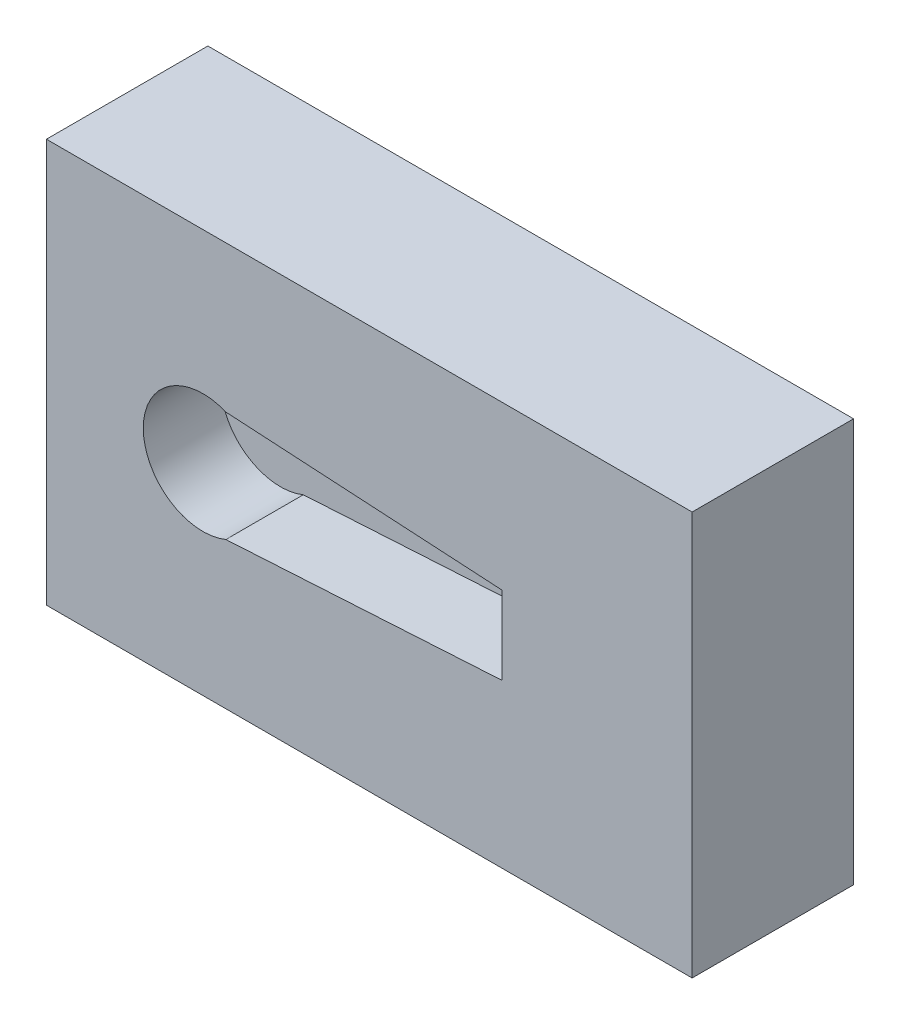
ISO-10303-21;
HEADER;
FILE_DESCRIPTION(('STEP AP214'),'2;1');
FILE_NAME('part.step','',(''),(''),'','','');
FILE_SCHEMA(('AUTOMOTIVE_DESIGN { 1 0 10303 214 1 1 1 1 }'));
ENDSEC;
DATA;
#1=APPLICATION_CONTEXT('core data for automotive mechanical design processes');
#2=APPLICATION_PROTOCOL_DEFINITION('international standard','automotive_design',2000,#1);
#3=PRODUCT_CONTEXT('',#1,'mechanical');
#4=PRODUCT('Part','Part','',(#3));
#5=PRODUCT_RELATED_PRODUCT_CATEGORY('part','',(#4));
#6=PRODUCT_DEFINITION_FORMATION('','',#4);
#7=PRODUCT_DEFINITION_CONTEXT('part definition',#1,'design');
#8=PRODUCT_DEFINITION('design','',#6,#7);
#9=PRODUCT_DEFINITION_SHAPE('','',#8);
#10=(LENGTH_UNIT() NAMED_UNIT(*) SI_UNIT(.MILLI.,.METRE.));
#11=(NAMED_UNIT(*) PLANE_ANGLE_UNIT() SI_UNIT($,.RADIAN.));
#12=(NAMED_UNIT(*) SI_UNIT($,.STERADIAN.) SOLID_ANGLE_UNIT());
#13=UNCERTAINTY_MEASURE_WITH_UNIT(LENGTH_MEASURE(1.E-05),#10,'distance_accuracy_value','');
#14=(GEOMETRIC_REPRESENTATION_CONTEXT(3) GLOBAL_UNCERTAINTY_ASSIGNED_CONTEXT((#13)) GLOBAL_UNIT_ASSIGNED_CONTEXT((#10,
#11,#12)) REPRESENTATION_CONTEXT('',''));
#15=CARTESIAN_POINT('',(0.,0.,0.));
#16=DIRECTION('',(0.,0.,1.));
#17=DIRECTION('',(1.,0.,0.));
#18=AXIS2_PLACEMENT_3D('',#15,#16,#17);
#19=CARTESIAN_POINT('',(0.,0.,10.));
#20=DIRECTION('',(0.,0.,1.));
#21=DIRECTION('',(1.,0.,0.));
#22=AXIS2_PLACEMENT_3D('',#19,#20,#21);
#23=PLANE('',#22);
#24=CARTESIAN_POINT('',(-7.96621438263229,1.28561736770692,10.));
#25=DIRECTION('',(0.,0.,1.));
#26=DIRECTION('',(1.,0.,0.));
#27=AXIS2_PLACEMENT_3D('',#24,#25,#26);
#28=CIRCLE('',#27,3.7);
#29=CARTESIAN_POINT('',(-6.55426537505447,4.70561736770692,10.));
#30=VERTEX_POINT('',#29);
#31=CARTESIAN_POINT('',(-6.55426537505447,-2.13438263229308,10.));
#32=VERTEX_POINT('',#31);
#33=EDGE_CURVE('E166',#30,#32,#28,.T.);
#34=ORIENTED_EDGE('',*,*,#33,.F.);
#35=DIRECTION('',(-0.998298031423657,0.0583184400996108,0.));
#36=VECTOR('',#35,1.);
#37=CARTESIAN_POINT('',(-6.55426537505447,4.70561736770692,10.));
#38=LINE('',#37,#36);
#39=CARTESIAN_POINT('',(10.5637856173677,3.70561736770692,10.));
#40=VERTEX_POINT('',#39);
#41=EDGE_CURVE('E180',#40,#30,#38,.T.);
#42=ORIENTED_EDGE('',*,*,#41,.F.);
#43=DIRECTION('',(0.,1.,0.));
#44=VECTOR('',#43,1.);
#45=CARTESIAN_POINT('',(10.5637856173677,-1.13438263229308,10.));
#46=LINE('',#45,#44);
#47=CARTESIAN_POINT('',(10.5637856173677,-1.13438263229308,10.));
#48=VERTEX_POINT('',#47);
#49=EDGE_CURVE('E71',#48,#40,#46,.T.);
#50=ORIENTED_EDGE('',*,*,#49,.F.);
#51=DIRECTION('',(0.998298031423657,0.0583184400996108,0.));
#52=VECTOR('',#51,1.);
#53=CARTESIAN_POINT('',(10.5637856173677,-1.13438263229308,10.));
#54=LINE('',#53,#52);
#55=EDGE_CURVE('E171',#32,#48,#54,.T.);
#56=ORIENTED_EDGE('',*,*,#55,.F.);
#57=EDGE_LOOP('',(#34,#42,#50,#56));
#58=FACE_BOUND('',#57,.T.);
#59=DIRECTION('',(0.,-1.,0.));
#60=VECTOR('',#59,1.);
#61=CARTESIAN_POINT('',(-17.6662143826323,13.7856173677069,10.));
#62=LINE('',#61,#60);
#63=CARTESIAN_POINT('',(-17.6662143826323,13.7856173677069,10.));
#64=VERTEX_POINT('',#63);
#65=CARTESIAN_POINT('',(-17.6662143826323,-11.2143826322931,10.));
#66=VERTEX_POINT('',#65);
#67=EDGE_CURVE('E110',#64,#66,#62,.T.);
#68=ORIENTED_EDGE('',*,*,#67,.T.);
#69=DIRECTION('',(1.,0.,0.));
#70=VECTOR('',#69,1.);
#71=CARTESIAN_POINT('',(-17.6662143826323,-11.2143826322931,10.));
#72=LINE('',#71,#70);
#73=CARTESIAN_POINT('',(22.3337856173677,-11.2143826322931,10.));
#74=VERTEX_POINT('',#73);
#75=EDGE_CURVE('E112',#66,#74,#72,.T.);
#76=ORIENTED_EDGE('',*,*,#75,.T.);
#77=DIRECTION('',(0.,1.,0.));
#78=VECTOR('',#77,1.);
#79=CARTESIAN_POINT('',(22.3337856173677,13.7856173677069,10.));
#80=LINE('',#79,#78);
#81=CARTESIAN_POINT('',(22.3337856173677,13.7856173677069,10.));
#82=VERTEX_POINT('',#81);
#83=EDGE_CURVE('E63',#74,#82,#80,.T.);
#84=ORIENTED_EDGE('',*,*,#83,.T.);
#85=DIRECTION('',(-1.,0.,0.));
#86=VECTOR('',#85,1.);
#87=CARTESIAN_POINT('',(-17.6662143826323,13.7856173677069,10.));
#88=LINE('',#87,#86);
#89=EDGE_CURVE('E113',#82,#64,#88,.T.);
#90=ORIENTED_EDGE('',*,*,#89,.T.);
#91=EDGE_LOOP('',(#68,#76,#84,#90));
#92=FACE_BOUND('',#91,.T.);
#93=ADVANCED_FACE('F47',(#58,#92),#23,.T.);
#94=CARTESIAN_POINT('',(-7.96621438263229,1.28561736770692,5.2));
#95=DIRECTION('',(0.,0.,1.));
#96=DIRECTION('',(1.,0.,0.));
#97=AXIS2_PLACEMENT_3D('',#94,#95,#96);
#98=CYLINDRICAL_SURFACE('',#97,3.7);
#99=ORIENTED_EDGE('',*,*,#33,.T.);
#100=DIRECTION('',(0.,0.,1.));
#101=VECTOR('',#100,1.);
#102=CARTESIAN_POINT('',(-6.55426537505447,-2.13438263229308,5.2));
#103=LINE('',#102,#101);
#104=CARTESIAN_POINT('',(-6.55426537505447,-2.13438263229308,5.2));
#105=VERTEX_POINT('',#104);
#106=EDGE_CURVE('E144',#105,#32,#103,.T.);
#107=ORIENTED_EDGE('',*,*,#106,.F.);
#108=CARTESIAN_POINT('',(-7.96621438263229,1.28561736770692,5.2));
#109=DIRECTION('',(0.,0.,1.));
#110=DIRECTION('',(1.,0.,0.));
#111=AXIS2_PLACEMENT_3D('',#108,#109,#110);
#112=CIRCLE('',#111,3.7);
#113=CARTESIAN_POINT('',(-6.55426537505447,4.70561736770692,5.2));
#114=VERTEX_POINT('',#113);
#115=EDGE_CURVE('E175',#114,#105,#112,.T.);
#116=ORIENTED_EDGE('',*,*,#115,.F.);
#117=DIRECTION('',(0.,0.,1.));
#118=VECTOR('',#117,1.);
#119=CARTESIAN_POINT('',(-6.55426537505447,4.70561736770692,5.2));
#120=LINE('',#119,#118);
#121=EDGE_CURVE('E135',#114,#30,#120,.T.);
#122=ORIENTED_EDGE('',*,*,#121,.T.);
#123=EDGE_LOOP('',(#99,#107,#116,#122));
#124=FACE_BOUND('',#123,.T.);
#125=ADVANCED_FACE('F212',(#124),#98,.F.);
#126=CARTESIAN_POINT('',(-6.55426537505447,4.70561736770692,5.2));
#127=DIRECTION('',(0.0583184400996108,0.998298031423656,0.));
#128=DIRECTION('',(-0.998298031423657,0.0583184400996108,0.));
#129=AXIS2_PLACEMENT_3D('',#126,#127,#128);
#130=PLANE('',#129);
#131=ORIENTED_EDGE('',*,*,#41,.T.);
#132=ORIENTED_EDGE('',*,*,#121,.F.);
#133=DIRECTION('',(-0.998298031423657,0.0583184400996108,0.));
#134=VECTOR('',#133,1.);
#135=CARTESIAN_POINT('',(-6.55426537505447,4.70561736770692,5.2));
#136=LINE('',#135,#134);
#137=CARTESIAN_POINT('',(10.5637856173677,3.70561736770692,5.2));
#138=VERTEX_POINT('',#137);
#139=EDGE_CURVE('E188',#138,#114,#136,.T.);
#140=ORIENTED_EDGE('',*,*,#139,.F.);
#141=DIRECTION('',(0.,0.,1.));
#142=VECTOR('',#141,1.);
#143=CARTESIAN_POINT('',(10.5637856173677,3.70561736770692,5.2));
#144=LINE('',#143,#142);
#145=EDGE_CURVE('E141',#138,#40,#144,.T.);
#146=ORIENTED_EDGE('',*,*,#145,.T.);
#147=EDGE_LOOP('',(#131,#132,#140,#146));
#148=FACE_BOUND('',#147,.T.);
#149=ADVANCED_FACE('F216',(#148),#130,.F.);
#150=CARTESIAN_POINT('',(10.5637856173677,-1.13438263229308,5.2));
#151=DIRECTION('',(1.,0.,0.));
#152=DIRECTION('',(0.,1.,0.));
#153=AXIS2_PLACEMENT_3D('',#150,#151,#152);
#154=PLANE('',#153);
#155=ORIENTED_EDGE('',*,*,#49,.T.);
#156=ORIENTED_EDGE('',*,*,#145,.F.);
#157=DIRECTION('',(0.,1.,0.));
#158=VECTOR('',#157,1.);
#159=CARTESIAN_POINT('',(10.5637856173677,-1.13438263229308,5.2));
#160=LINE('',#159,#158);
#161=CARTESIAN_POINT('',(10.5637856173677,-1.13438263229308,5.2));
#162=VERTEX_POINT('',#161);
#163=EDGE_CURVE('E184',#162,#138,#160,.T.);
#164=ORIENTED_EDGE('',*,*,#163,.F.);
#165=DIRECTION('',(0.,0.,1.));
#166=VECTOR('',#165,1.);
#167=CARTESIAN_POINT('',(10.5637856173677,-1.13438263229308,5.2));
#168=LINE('',#167,#166);
#169=EDGE_CURVE('E201',#162,#48,#168,.T.);
#170=ORIENTED_EDGE('',*,*,#169,.T.);
#171=EDGE_LOOP('',(#155,#156,#164,#170));
#172=FACE_BOUND('',#171,.T.);
#173=ADVANCED_FACE('F218',(#172),#154,.F.);
#174=CARTESIAN_POINT('',(10.5637856173677,-1.13438263229308,5.2));
#175=DIRECTION('',(0.0583184400996108,-0.998298031423656,0.));
#176=DIRECTION('',(0.998298031423657,0.0583184400996109,0.));
#177=AXIS2_PLACEMENT_3D('',#174,#175,#176);
#178=PLANE('',#177);
#179=ORIENTED_EDGE('',*,*,#55,.T.);
#180=ORIENTED_EDGE('',*,*,#169,.F.);
#181=DIRECTION('',(0.998298031423657,0.0583184400996108,0.));
#182=VECTOR('',#181,1.);
#183=CARTESIAN_POINT('',(10.5637856173677,-1.13438263229308,5.2));
#184=LINE('',#183,#182);
#185=EDGE_CURVE('E179',#105,#162,#184,.T.);
#186=ORIENTED_EDGE('',*,*,#185,.F.);
#187=ORIENTED_EDGE('',*,*,#106,.T.);
#188=EDGE_LOOP('',(#179,#180,#186,#187));
#189=FACE_BOUND('',#188,.T.);
#190=ADVANCED_FACE('F207',(#189),#178,.F.);
#191=CARTESIAN_POINT('',(-7.96621438263229,1.28561736770692,5.2));
#192=DIRECTION('',(0.,0.,1.));
#193=DIRECTION('',(1.,0.,0.));
#194=AXIS2_PLACEMENT_3D('',#191,#192,#193);
#195=PLANE('',#194);
#196=ORIENTED_EDGE('',*,*,#115,.T.);
#197=ORIENTED_EDGE('',*,*,#185,.T.);
#198=ORIENTED_EDGE('',*,*,#163,.T.);
#199=ORIENTED_EDGE('',*,*,#139,.T.);
#200=EDGE_LOOP('',(#196,#197,#198,#199));
#201=FACE_BOUND('',#200,.T.);
#202=ADVANCED_FACE('F220',(#201),#195,.T.);
#203=CARTESIAN_POINT('',(0.,0.,0.));
#204=DIRECTION('',(0.,0.,1.));
#205=DIRECTION('',(1.,0.,0.));
#206=AXIS2_PLACEMENT_3D('',#203,#204,#205);
#207=PLANE('',#206);
#208=DIRECTION('',(0.,-1.,0.));
#209=VECTOR('',#208,1.);
#210=CARTESIAN_POINT('',(-17.6662143826323,13.7856173677069,0.));
#211=LINE('',#210,#209);
#212=CARTESIAN_POINT('',(-17.6662143826323,13.7856173677069,0.));
#213=VERTEX_POINT('',#212);
#214=CARTESIAN_POINT('',(-17.6662143826323,-11.2143826322931,0.));
#215=VERTEX_POINT('',#214);
#216=EDGE_CURVE('E128',#213,#215,#211,.T.);
#217=ORIENTED_EDGE('',*,*,#216,.F.);
#218=DIRECTION('',(-1.,0.,0.));
#219=VECTOR('',#218,1.);
#220=CARTESIAN_POINT('',(-17.6662143826323,13.7856173677069,0.));
#221=LINE('',#220,#219);
#222=CARTESIAN_POINT('',(22.3337856173677,13.7856173677069,0.));
#223=VERTEX_POINT('',#222);
#224=EDGE_CURVE('E150',#223,#213,#221,.T.);
#225=ORIENTED_EDGE('',*,*,#224,.F.);
#226=DIRECTION('',(0.,1.,0.));
#227=VECTOR('',#226,1.);
#228=CARTESIAN_POINT('',(22.3337856173677,13.7856173677069,0.));
#229=LINE('',#228,#227);
#230=CARTESIAN_POINT('',(22.3337856173677,-11.2143826322931,0.));
#231=VERTEX_POINT('',#230);
#232=EDGE_CURVE('E139',#231,#223,#229,.T.);
#233=ORIENTED_EDGE('',*,*,#232,.F.);
#234=DIRECTION('',(1.,0.,0.));
#235=VECTOR('',#234,1.);
#236=CARTESIAN_POINT('',(-17.6662143826323,-11.2143826322931,0.));
#237=LINE('',#236,#235);
#238=EDGE_CURVE('E134',#215,#231,#237,.T.);
#239=ORIENTED_EDGE('',*,*,#238,.F.);
#240=EDGE_LOOP('',(#217,#225,#233,#239));
#241=FACE_BOUND('',#240,.T.);
#242=ADVANCED_FACE('F162',(#241),#207,.F.);
#243=CARTESIAN_POINT('',(-17.6662143826323,13.7856173677069,15.));
#244=DIRECTION('',(0.,-1.,0.));
#245=DIRECTION('',(0.,0.,-1.));
#246=AXIS2_PLACEMENT_3D('',#243,#244,#245);
#247=PLANE('',#246);
#248=ORIENTED_EDGE('',*,*,#89,.F.);
#249=DIRECTION('',(0.,0.,-1.));
#250=VECTOR('',#249,1.);
#251=CARTESIAN_POINT('',(22.3337856173677,13.7856173677069,15.));
#252=LINE('',#251,#250);
#253=EDGE_CURVE('E155',#82,#223,#252,.T.);
#254=ORIENTED_EDGE('',*,*,#253,.T.);
#255=ORIENTED_EDGE('',*,*,#224,.T.);
#256=DIRECTION('',(0.,0.,-1.));
#257=VECTOR('',#256,1.);
#258=CARTESIAN_POINT('',(-17.6662143826323,13.7856173677069,15.));
#259=LINE('',#258,#257);
#260=EDGE_CURVE('E129',#64,#213,#259,.T.);
#261=ORIENTED_EDGE('',*,*,#260,.F.);
#262=EDGE_LOOP('',(#248,#254,#255,#261));
#263=FACE_BOUND('',#262,.T.);
#264=ADVANCED_FACE('F164',(#263),#247,.F.);
#265=CARTESIAN_POINT('',(22.3337856173677,13.7856173677069,15.));
#266=DIRECTION('',(-1.,0.,0.));
#267=DIRECTION('',(0.,-1.,0.));
#268=AXIS2_PLACEMENT_3D('',#265,#266,#267);
#269=PLANE('',#268);
#270=ORIENTED_EDGE('',*,*,#83,.F.);
#271=DIRECTION('',(0.,0.,-1.));
#272=VECTOR('',#271,1.);
#273=CARTESIAN_POINT('',(22.3337856173677,-11.2143826322931,15.));
#274=LINE('',#273,#272);
#275=EDGE_CURVE('E56',#74,#231,#274,.T.);
#276=ORIENTED_EDGE('',*,*,#275,.T.);
#277=ORIENTED_EDGE('',*,*,#232,.T.);
#278=ORIENTED_EDGE('',*,*,#253,.F.);
#279=EDGE_LOOP('',(#270,#276,#277,#278));
#280=FACE_BOUND('',#279,.T.);
#281=ADVANCED_FACE('F159',(#280),#269,.F.);
#282=CARTESIAN_POINT('',(-17.6662143826323,-11.2143826322931,15.));
#283=DIRECTION('',(0.,1.,0.));
#284=DIRECTION('',(0.,0.,1.));
#285=AXIS2_PLACEMENT_3D('',#282,#283,#284);
#286=PLANE('',#285);
#287=ORIENTED_EDGE('',*,*,#75,.F.);
#288=DIRECTION('',(0.,0.,-1.));
#289=VECTOR('',#288,1.);
#290=CARTESIAN_POINT('',(-17.6662143826323,-11.2143826322931,15.));
#291=LINE('',#290,#289);
#292=EDGE_CURVE('E11',#66,#215,#291,.T.);
#293=ORIENTED_EDGE('',*,*,#292,.T.);
#294=ORIENTED_EDGE('',*,*,#238,.T.);
#295=ORIENTED_EDGE('',*,*,#275,.F.);
#296=EDGE_LOOP('',(#287,#293,#294,#295));
#297=FACE_BOUND('',#296,.T.);
#298=ADVANCED_FACE('F121',(#297),#286,.F.);
#299=CARTESIAN_POINT('',(-17.6662143826323,13.7856173677069,15.));
#300=DIRECTION('',(1.,0.,0.));
#301=DIRECTION('',(0.,0.,-1.));
#302=AXIS2_PLACEMENT_3D('',#299,#300,#301);
#303=PLANE('',#302);
#304=ORIENTED_EDGE('',*,*,#67,.F.);
#305=ORIENTED_EDGE('',*,*,#260,.T.);
#306=ORIENTED_EDGE('',*,*,#216,.T.);
#307=ORIENTED_EDGE('',*,*,#292,.F.);
#308=EDGE_LOOP('',(#304,#305,#306,#307));
#309=FACE_BOUND('',#308,.T.);
#310=ADVANCED_FACE('F49',(#309),#303,.F.);
#311=CLOSED_SHELL('',(#93,#125,#149,#173,#190,#202,#242,#264,#281,#298,#310));
#312=MANIFOLD_SOLID_BREP('B2',#311);
#313=ADVANCED_BREP_SHAPE_REPRESENTATION('',(#18,#312),#14);
#314=SHAPE_DEFINITION_REPRESENTATION(#9,#313);
ENDSEC;
END-ISO-10303-21;
